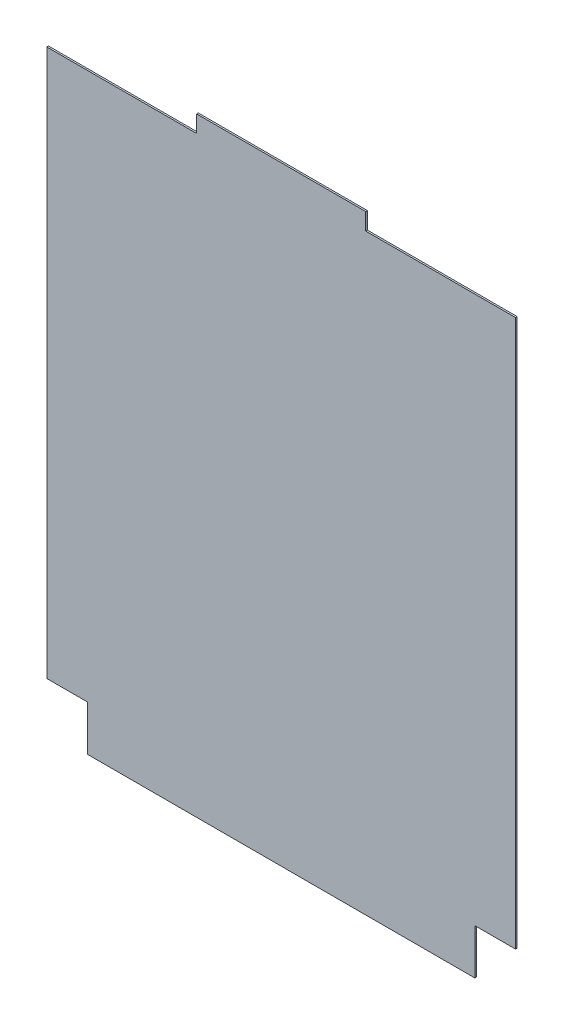
ISO-10303-21;
HEADER;
FILE_DESCRIPTION(('STEP AP214'),'2;1');
FILE_NAME('part.step','',(''),(''),'','','');
FILE_SCHEMA(('AUTOMOTIVE_DESIGN { 1 0 10303 214 1 1 1 1 }'));
ENDSEC;
DATA;
#1=APPLICATION_CONTEXT('core data for automotive mechanical design processes');
#2=APPLICATION_PROTOCOL_DEFINITION('international standard','automotive_design',2000,#1);
#3=PRODUCT_CONTEXT('',#1,'mechanical');
#4=PRODUCT('Part','Part','',(#3));
#5=PRODUCT_RELATED_PRODUCT_CATEGORY('part','',(#4));
#6=PRODUCT_DEFINITION_FORMATION('','',#4);
#7=PRODUCT_DEFINITION_CONTEXT('part definition',#1,'design');
#8=PRODUCT_DEFINITION('design','',#6,#7);
#9=PRODUCT_DEFINITION_SHAPE('','',#8);
#10=(LENGTH_UNIT() NAMED_UNIT(*) SI_UNIT(.MILLI.,.METRE.));
#11=(NAMED_UNIT(*) PLANE_ANGLE_UNIT() SI_UNIT($,.RADIAN.));
#12=(NAMED_UNIT(*) SI_UNIT($,.STERADIAN.) SOLID_ANGLE_UNIT());
#13=UNCERTAINTY_MEASURE_WITH_UNIT(LENGTH_MEASURE(1.E-05),#10,'distance_accuracy_value','');
#14=(GEOMETRIC_REPRESENTATION_CONTEXT(3) GLOBAL_UNCERTAINTY_ASSIGNED_CONTEXT((#13)) GLOBAL_UNIT_ASSIGNED_CONTEXT((#10,
#11,#12)) REPRESENTATION_CONTEXT('',''));
#15=CARTESIAN_POINT('',(0.,0.,0.));
#16=DIRECTION('',(0.,0.,1.));
#17=DIRECTION('',(1.,0.,0.));
#18=AXIS2_PLACEMENT_3D('',#15,#16,#17);
#19=CARTESIAN_POINT('',(7.41806516052539,-16.2979296497676,0.));
#20=DIRECTION('',(0.,0.,1.));
#21=DIRECTION('',(1.,0.,0.));
#22=AXIS2_PLACEMENT_3D('',#19,#20,#21);
#23=PLANE('',#22);
#24=DIRECTION('',(0.,1.,0.));
#25=VECTOR('',#24,1.);
#26=CARTESIAN_POINT('',(-15.4819348394746,-13.6179296497676,0.));
#27=LINE('',#26,#25);
#28=CARTESIAN_POINT('',(-15.4819348394746,-16.2979296497676,0.));
#29=VERTEX_POINT('',#28);
#30=CARTESIAN_POINT('',(-15.4819348394746,-13.6179296497676,0.));
#31=VERTEX_POINT('',#30);
#32=EDGE_CURVE('E169',#29,#31,#27,.T.);
#33=ORIENTED_EDGE('',*,*,#32,.T.);
#34=DIRECTION('',(1.,0.,0.));
#35=VECTOR('',#34,1.);
#36=CARTESIAN_POINT('',(-17.8819348394746,-13.6179296497676,0.));
#37=LINE('',#36,#35);
#38=CARTESIAN_POINT('',(-17.8819348394746,-13.6179296497676,0.));
#39=VERTEX_POINT('',#38);
#40=EDGE_CURVE('E164',#31,#39,#37,.F.);
#41=ORIENTED_EDGE('',*,*,#40,.T.);
#42=DIRECTION('',(0.,1.,0.));
#43=VECTOR('',#42,1.);
#44=CARTESIAN_POINT('',(-17.8819348394746,18.7120703502324,0.));
#45=LINE('',#44,#43);
#46=CARTESIAN_POINT('',(-17.8819348394746,18.7120703502324,0.));
#47=VERTEX_POINT('',#46);
#48=EDGE_CURVE('E159',#39,#47,#45,.T.);
#49=ORIENTED_EDGE('',*,*,#48,.T.);
#50=DIRECTION('',(1.,0.,0.));
#51=VECTOR('',#50,1.);
#52=CARTESIAN_POINT('',(-9.03193483947462,18.7120703502324,0.));
#53=LINE('',#52,#51);
#54=CARTESIAN_POINT('',(-9.03193483947462,18.7120703502324,0.));
#55=VERTEX_POINT('',#54);
#56=EDGE_CURVE('E154',#47,#55,#53,.T.);
#57=ORIENTED_EDGE('',*,*,#56,.T.);
#58=DIRECTION('',(0.,1.,0.));
#59=VECTOR('',#58,1.);
#60=CARTESIAN_POINT('',(-9.03193483947462,19.7120703502324,0.));
#61=LINE('',#60,#59);
#62=CARTESIAN_POINT('',(-9.03193483947462,19.7120703502324,0.));
#63=VERTEX_POINT('',#62);
#64=EDGE_CURVE('E149',#55,#63,#61,.T.);
#65=ORIENTED_EDGE('',*,*,#64,.T.);
#66=DIRECTION('',(1.,0.,0.));
#67=VECTOR('',#66,1.);
#68=CARTESIAN_POINT('',(0.968065160525386,19.7120703502324,0.));
#69=LINE('',#68,#67);
#70=CARTESIAN_POINT('',(0.968065160525386,19.7120703502324,0.));
#71=VERTEX_POINT('',#70);
#72=EDGE_CURVE('E144',#63,#71,#69,.T.);
#73=ORIENTED_EDGE('',*,*,#72,.T.);
#74=DIRECTION('',(0.,1.,0.));
#75=VECTOR('',#74,1.);
#76=CARTESIAN_POINT('',(0.968065160525386,18.7120703502324,0.));
#77=LINE('',#76,#75);
#78=CARTESIAN_POINT('',(0.968065160525386,18.7120703502324,0.));
#79=VERTEX_POINT('',#78);
#80=EDGE_CURVE('E139',#71,#79,#77,.F.);
#81=ORIENTED_EDGE('',*,*,#80,.T.);
#82=DIRECTION('',(1.,0.,0.));
#83=VECTOR('',#82,1.);
#84=CARTESIAN_POINT('',(9.81806516052539,18.7120703502324,0.));
#85=LINE('',#84,#83);
#86=CARTESIAN_POINT('',(9.81806516052539,18.7120703502324,0.));
#87=VERTEX_POINT('',#86);
#88=EDGE_CURVE('E134',#79,#87,#85,.T.);
#89=ORIENTED_EDGE('',*,*,#88,.T.);
#90=DIRECTION('',(0.,-1.,0.));
#91=VECTOR('',#90,1.);
#92=CARTESIAN_POINT('',(9.81806516052539,-13.6179296497676,0.));
#93=LINE('',#92,#91);
#94=CARTESIAN_POINT('',(9.81806516052539,-13.6179296497676,0.));
#95=VERTEX_POINT('',#94);
#96=EDGE_CURVE('E130',#87,#95,#93,.T.);
#97=ORIENTED_EDGE('',*,*,#96,.T.);
#98=DIRECTION('',(1.,0.,0.));
#99=VECTOR('',#98,1.);
#100=CARTESIAN_POINT('',(7.41806516052539,-13.6179296497676,0.));
#101=LINE('',#100,#99);
#102=CARTESIAN_POINT('',(7.41806516052539,-13.6179296497676,0.));
#103=VERTEX_POINT('',#102);
#104=EDGE_CURVE('E117',#95,#103,#101,.F.);
#105=ORIENTED_EDGE('',*,*,#104,.T.);
#106=DIRECTION('',(0.,-1.,0.));
#107=VECTOR('',#106,1.);
#108=CARTESIAN_POINT('',(7.41806516052539,-16.2979296497676,0.));
#109=LINE('',#108,#107);
#110=CARTESIAN_POINT('',(7.41806516052539,-16.2979296497676,0.));
#111=VERTEX_POINT('',#110);
#112=EDGE_CURVE('E103',#103,#111,#109,.T.);
#113=ORIENTED_EDGE('',*,*,#112,.T.);
#114=DIRECTION('',(1.,0.,0.));
#115=VECTOR('',#114,1.);
#116=CARTESIAN_POINT('',(-15.4819348394746,-16.2979296497676,0.));
#117=LINE('',#116,#115);
#118=EDGE_CURVE('E20',#111,#29,#117,.F.);
#119=ORIENTED_EDGE('',*,*,#118,.T.);
#120=EDGE_LOOP('',(#33,#41,#49,#57,#65,#73,#81,#89,#97,#105,#113,#119));
#121=FACE_BOUND('',#120,.T.);
#122=ADVANCED_FACE('F17',(#121),#23,.F.);
#123=CARTESIAN_POINT('',(-15.4819348394746,-16.2979296497676,0.1));
#124=DIRECTION('',(0.,1.,0.));
#125=DIRECTION('',(0.,0.,1.));
#126=AXIS2_PLACEMENT_3D('',#123,#124,#125);
#127=PLANE('',#126);
#128=DIRECTION('',(0.,0.,1.));
#129=VECTOR('',#128,1.);
#130=CARTESIAN_POINT('',(7.41806516052539,-16.2979296497676,0.1));
#131=LINE('',#130,#129);
#132=CARTESIAN_POINT('',(7.41806516052539,-16.2979296497676,0.1));
#133=VERTEX_POINT('',#132);
#134=EDGE_CURVE('E109',#111,#133,#131,.T.);
#135=ORIENTED_EDGE('',*,*,#134,.T.);
#136=DIRECTION('',(1.,0.,0.));
#137=VECTOR('',#136,1.);
#138=CARTESIAN_POINT('',(7.41806516052539,-16.2979296497676,0.1));
#139=LINE('',#138,#137);
#140=CARTESIAN_POINT('',(-15.4819348394746,-16.2979296497676,0.1));
#141=VERTEX_POINT('',#140);
#142=EDGE_CURVE('E171',#141,#133,#139,.T.);
#143=ORIENTED_EDGE('',*,*,#142,.F.);
#144=DIRECTION('',(0.,0.,1.));
#145=VECTOR('',#144,1.);
#146=CARTESIAN_POINT('',(-15.4819348394746,-16.2979296497676,0.1));
#147=LINE('',#146,#145);
#148=EDGE_CURVE('E112',#141,#29,#147,.F.);
#149=ORIENTED_EDGE('',*,*,#148,.T.);
#150=ORIENTED_EDGE('',*,*,#118,.F.);
#151=EDGE_LOOP('',(#135,#143,#149,#150));
#152=FACE_BOUND('',#151,.T.);
#153=ADVANCED_FACE('F108',(#152),#127,.F.);
#154=CARTESIAN_POINT('',(7.41806516052539,-16.2979296497676,0.1));
#155=DIRECTION('',(-1.,0.,0.));
#156=DIRECTION('',(0.,-1.,0.));
#157=AXIS2_PLACEMENT_3D('',#154,#155,#156);
#158=PLANE('',#157);
#159=DIRECTION('',(0.,0.,1.));
#160=VECTOR('',#159,1.);
#161=CARTESIAN_POINT('',(7.41806516052539,-13.6179296497676,0.1));
#162=LINE('',#161,#160);
#163=CARTESIAN_POINT('',(7.41806516052539,-13.6179296497676,0.1));
#164=VERTEX_POINT('',#163);
#165=EDGE_CURVE('E119',#103,#164,#162,.T.);
#166=ORIENTED_EDGE('',*,*,#165,.T.);
#167=DIRECTION('',(0.,1.,0.));
#168=VECTOR('',#167,1.);
#169=CARTESIAN_POINT('',(7.41806516052539,-16.2979296497676,0.1));
#170=LINE('',#169,#168);
#171=EDGE_CURVE('E123',#133,#164,#170,.T.);
#172=ORIENTED_EDGE('',*,*,#171,.F.);
#173=ORIENTED_EDGE('',*,*,#134,.F.);
#174=ORIENTED_EDGE('',*,*,#112,.F.);
#175=EDGE_LOOP('',(#166,#172,#173,#174));
#176=FACE_BOUND('',#175,.T.);
#177=ADVANCED_FACE('F121',(#176),#158,.F.);
#178=CARTESIAN_POINT('',(7.41806516052539,-13.6179296497676,0.1));
#179=DIRECTION('',(0.,1.,0.));
#180=DIRECTION('',(0.,0.,1.));
#181=AXIS2_PLACEMENT_3D('',#178,#179,#180);
#182=PLANE('',#181);
#183=DIRECTION('',(0.,0.,1.));
#184=VECTOR('',#183,1.);
#185=CARTESIAN_POINT('',(9.81806516052539,-13.6179296497676,0.1));
#186=LINE('',#185,#184);
#187=CARTESIAN_POINT('',(9.81806516052539,-13.6179296497676,0.1));
#188=VERTEX_POINT('',#187);
#189=EDGE_CURVE('E128',#95,#188,#186,.T.);
#190=ORIENTED_EDGE('',*,*,#189,.T.);
#191=DIRECTION('',(1.,0.,0.));
#192=VECTOR('',#191,1.);
#193=CARTESIAN_POINT('',(7.41806516052539,-13.6179296497676,0.1));
#194=LINE('',#193,#192);
#195=EDGE_CURVE('E174',#164,#188,#194,.T.);
#196=ORIENTED_EDGE('',*,*,#195,.F.);
#197=ORIENTED_EDGE('',*,*,#165,.F.);
#198=ORIENTED_EDGE('',*,*,#104,.F.);
#199=EDGE_LOOP('',(#190,#196,#197,#198));
#200=FACE_BOUND('',#199,.T.);
#201=ADVANCED_FACE('F244',(#200),#182,.F.);
#202=CARTESIAN_POINT('',(9.81806516052539,-13.6179296497676,0.1));
#203=DIRECTION('',(-1.,0.,0.));
#204=DIRECTION('',(0.,-1.,0.));
#205=AXIS2_PLACEMENT_3D('',#202,#203,#204);
#206=PLANE('',#205);
#207=DIRECTION('',(0.,0.,-1.));
#208=VECTOR('',#207,1.);
#209=CARTESIAN_POINT('',(9.81806516052539,18.7120703502324,0.1));
#210=LINE('',#209,#208);
#211=CARTESIAN_POINT('',(9.81806516052539,18.7120703502324,0.1));
#212=VERTEX_POINT('',#211);
#213=EDGE_CURVE('E132',#87,#212,#210,.F.);
#214=ORIENTED_EDGE('',*,*,#213,.T.);
#215=DIRECTION('',(0.,1.,0.));
#216=VECTOR('',#215,1.);
#217=CARTESIAN_POINT('',(9.81806516052539,-16.2979296497676,0.1));
#218=LINE('',#217,#216);
#219=EDGE_CURVE('E177',#188,#212,#218,.T.);
#220=ORIENTED_EDGE('',*,*,#219,.F.);
#221=ORIENTED_EDGE('',*,*,#189,.F.);
#222=ORIENTED_EDGE('',*,*,#96,.F.);
#223=EDGE_LOOP('',(#214,#220,#221,#222));
#224=FACE_BOUND('',#223,.T.);
#225=ADVANCED_FACE('F240',(#224),#206,.F.);
#226=CARTESIAN_POINT('',(9.81806516052539,18.7120703502324,0.1));
#227=DIRECTION('',(0.,-1.,0.));
#228=DIRECTION('',(0.,0.,-1.));
#229=AXIS2_PLACEMENT_3D('',#226,#227,#228);
#230=PLANE('',#229);
#231=DIRECTION('',(0.,0.,1.));
#232=VECTOR('',#231,1.);
#233=CARTESIAN_POINT('',(0.968065160525386,18.7120703502324,0.1));
#234=LINE('',#233,#232);
#235=CARTESIAN_POINT('',(0.968065160525386,18.7120703502324,0.1));
#236=VERTEX_POINT('',#235);
#237=EDGE_CURVE('E137',#79,#236,#234,.T.);
#238=ORIENTED_EDGE('',*,*,#237,.T.);
#239=DIRECTION('',(1.,0.,0.));
#240=VECTOR('',#239,1.);
#241=CARTESIAN_POINT('',(7.41806516052539,18.7120703502324,0.1));
#242=LINE('',#241,#240);
#243=EDGE_CURVE('E180',#212,#236,#242,.F.);
#244=ORIENTED_EDGE('',*,*,#243,.F.);
#245=ORIENTED_EDGE('',*,*,#213,.F.);
#246=ORIENTED_EDGE('',*,*,#88,.F.);
#247=EDGE_LOOP('',(#238,#244,#245,#246));
#248=FACE_BOUND('',#247,.T.);
#249=ADVANCED_FACE('F236',(#248),#230,.F.);
#250=CARTESIAN_POINT('',(0.968065160525386,18.7120703502324,0.1));
#251=DIRECTION('',(-1.,0.,0.));
#252=DIRECTION('',(0.,0.,1.));
#253=AXIS2_PLACEMENT_3D('',#250,#251,#252);
#254=PLANE('',#253);
#255=DIRECTION('',(0.,0.,1.));
#256=VECTOR('',#255,1.);
#257=CARTESIAN_POINT('',(0.968065160525386,19.7120703502324,0.1));
#258=LINE('',#257,#256);
#259=CARTESIAN_POINT('',(0.968065160525386,19.7120703502324,0.1));
#260=VERTEX_POINT('',#259);
#261=EDGE_CURVE('E142',#71,#260,#258,.T.);
#262=ORIENTED_EDGE('',*,*,#261,.T.);
#263=DIRECTION('',(0.,1.,0.));
#264=VECTOR('',#263,1.);
#265=CARTESIAN_POINT('',(0.968065160525386,-16.2979296497676,0.1));
#266=LINE('',#265,#264);
#267=EDGE_CURVE('E183',#236,#260,#266,.T.);
#268=ORIENTED_EDGE('',*,*,#267,.F.);
#269=ORIENTED_EDGE('',*,*,#237,.F.);
#270=ORIENTED_EDGE('',*,*,#80,.F.);
#271=EDGE_LOOP('',(#262,#268,#269,#270));
#272=FACE_BOUND('',#271,.T.);
#273=ADVANCED_FACE('F232',(#272),#254,.F.);
#274=CARTESIAN_POINT('',(0.968065160525386,19.7120703502324,0.1));
#275=DIRECTION('',(0.,-1.,0.));
#276=DIRECTION('',(1.,0.,0.));
#277=AXIS2_PLACEMENT_3D('',#274,#275,#276);
#278=PLANE('',#277);
#279=DIRECTION('',(0.,0.,-1.));
#280=VECTOR('',#279,1.);
#281=CARTESIAN_POINT('',(-9.03193483947462,19.7120703502324,0.1));
#282=LINE('',#281,#280);
#283=CARTESIAN_POINT('',(-9.03193483947462,19.7120703502324,0.1));
#284=VERTEX_POINT('',#283);
#285=EDGE_CURVE('E147',#63,#284,#282,.F.);
#286=ORIENTED_EDGE('',*,*,#285,.T.);
#287=DIRECTION('',(1.,0.,0.));
#288=VECTOR('',#287,1.);
#289=CARTESIAN_POINT('',(7.41806516052539,19.7120703502324,0.1));
#290=LINE('',#289,#288);
#291=EDGE_CURVE('E186',#260,#284,#290,.F.);
#292=ORIENTED_EDGE('',*,*,#291,.F.);
#293=ORIENTED_EDGE('',*,*,#261,.F.);
#294=ORIENTED_EDGE('',*,*,#72,.F.);
#295=EDGE_LOOP('',(#286,#292,#293,#294));
#296=FACE_BOUND('',#295,.T.);
#297=ADVANCED_FACE('F228',(#296),#278,.F.);
#298=CARTESIAN_POINT('',(-9.03193483947462,19.7120703502324,0.1));
#299=DIRECTION('',(1.,0.,0.));
#300=DIRECTION('',(0.,0.,-1.));
#301=AXIS2_PLACEMENT_3D('',#298,#299,#300);
#302=PLANE('',#301);
#303=DIRECTION('',(0.,0.,-1.));
#304=VECTOR('',#303,1.);
#305=CARTESIAN_POINT('',(-9.03193483947462,18.7120703502324,0.1));
#306=LINE('',#305,#304);
#307=CARTESIAN_POINT('',(-9.03193483947462,18.7120703502324,0.1));
#308=VERTEX_POINT('',#307);
#309=EDGE_CURVE('E152',#55,#308,#306,.F.);
#310=ORIENTED_EDGE('',*,*,#309,.T.);
#311=DIRECTION('',(0.,1.,0.));
#312=VECTOR('',#311,1.);
#313=CARTESIAN_POINT('',(-9.03193483947462,-16.2979296497676,0.1));
#314=LINE('',#313,#312);
#315=EDGE_CURVE('E189',#284,#308,#314,.F.);
#316=ORIENTED_EDGE('',*,*,#315,.F.);
#317=ORIENTED_EDGE('',*,*,#285,.F.);
#318=ORIENTED_EDGE('',*,*,#64,.F.);
#319=EDGE_LOOP('',(#310,#316,#317,#318));
#320=FACE_BOUND('',#319,.T.);
#321=ADVANCED_FACE('F224',(#320),#302,.F.);
#322=CARTESIAN_POINT('',(-9.03193483947462,18.7120703502324,0.1));
#323=DIRECTION('',(0.,-1.,0.));
#324=DIRECTION('',(0.,0.,-1.));
#325=AXIS2_PLACEMENT_3D('',#322,#323,#324);
#326=PLANE('',#325);
#327=DIRECTION('',(0.,0.,1.));
#328=VECTOR('',#327,1.);
#329=CARTESIAN_POINT('',(-17.8819348394746,18.7120703502324,0.1));
#330=LINE('',#329,#328);
#331=CARTESIAN_POINT('',(-17.8819348394746,18.7120703502324,0.1));
#332=VERTEX_POINT('',#331);
#333=EDGE_CURVE('E157',#47,#332,#330,.T.);
#334=ORIENTED_EDGE('',*,*,#333,.T.);
#335=DIRECTION('',(1.,0.,0.));
#336=VECTOR('',#335,1.);
#337=CARTESIAN_POINT('',(7.41806516052539,18.7120703502324,0.1));
#338=LINE('',#337,#336);
#339=EDGE_CURVE('E192',#308,#332,#338,.F.);
#340=ORIENTED_EDGE('',*,*,#339,.F.);
#341=ORIENTED_EDGE('',*,*,#309,.F.);
#342=ORIENTED_EDGE('',*,*,#56,.F.);
#343=EDGE_LOOP('',(#334,#340,#341,#342));
#344=FACE_BOUND('',#343,.T.);
#345=ADVANCED_FACE('F221',(#344),#326,.F.);
#346=CARTESIAN_POINT('',(-17.8819348394746,18.7120703502324,0.1));
#347=DIRECTION('',(1.,0.,0.));
#348=DIRECTION('',(0.,1.,0.));
#349=AXIS2_PLACEMENT_3D('',#346,#347,#348);
#350=PLANE('',#349);
#351=DIRECTION('',(0.,0.,1.));
#352=VECTOR('',#351,1.);
#353=CARTESIAN_POINT('',(-17.8819348394746,-13.6179296497676,0.1));
#354=LINE('',#353,#352);
#355=CARTESIAN_POINT('',(-17.8819348394746,-13.6179296497676,0.1));
#356=VERTEX_POINT('',#355);
#357=EDGE_CURVE('E162',#39,#356,#354,.T.);
#358=ORIENTED_EDGE('',*,*,#357,.T.);
#359=DIRECTION('',(0.,1.,0.));
#360=VECTOR('',#359,1.);
#361=CARTESIAN_POINT('',(-17.8819348394746,-16.2979296497676,0.1));
#362=LINE('',#361,#360);
#363=EDGE_CURVE('E195',#332,#356,#362,.F.);
#364=ORIENTED_EDGE('',*,*,#363,.F.);
#365=ORIENTED_EDGE('',*,*,#333,.F.);
#366=ORIENTED_EDGE('',*,*,#48,.F.);
#367=EDGE_LOOP('',(#358,#364,#365,#366));
#368=FACE_BOUND('',#367,.T.);
#369=ADVANCED_FACE('F205',(#368),#350,.F.);
#370=CARTESIAN_POINT('',(-17.8819348394746,-13.6179296497676,0.1));
#371=DIRECTION('',(0.,1.,0.));
#372=DIRECTION('',(0.,0.,1.));
#373=AXIS2_PLACEMENT_3D('',#370,#371,#372);
#374=PLANE('',#373);
#375=DIRECTION('',(0.,0.,1.));
#376=VECTOR('',#375,1.);
#377=CARTESIAN_POINT('',(-15.4819348394746,-13.6179296497676,0.1));
#378=LINE('',#377,#376);
#379=CARTESIAN_POINT('',(-15.4819348394746,-13.6179296497676,0.1));
#380=VERTEX_POINT('',#379);
#381=EDGE_CURVE('E35',#31,#380,#378,.T.);
#382=ORIENTED_EDGE('',*,*,#381,.T.);
#383=DIRECTION('',(1.,0.,0.));
#384=VECTOR('',#383,1.);
#385=CARTESIAN_POINT('',(7.41806516052539,-13.6179296497676,0.1));
#386=LINE('',#385,#384);
#387=EDGE_CURVE('E26',#356,#380,#386,.T.);
#388=ORIENTED_EDGE('',*,*,#387,.F.);
#389=ORIENTED_EDGE('',*,*,#357,.F.);
#390=ORIENTED_EDGE('',*,*,#40,.F.);
#391=EDGE_LOOP('',(#382,#388,#389,#390));
#392=FACE_BOUND('',#391,.T.);
#393=ADVANCED_FACE('F203',(#392),#374,.F.);
#394=CARTESIAN_POINT('',(-15.4819348394746,-13.6179296497676,0.1));
#395=DIRECTION('',(1.,0.,0.));
#396=DIRECTION('',(0.,1.,0.));
#397=AXIS2_PLACEMENT_3D('',#394,#395,#396);
#398=PLANE('',#397);
#399=ORIENTED_EDGE('',*,*,#148,.F.);
#400=DIRECTION('',(0.,1.,0.));
#401=VECTOR('',#400,1.);
#402=CARTESIAN_POINT('',(-15.4819348394746,-16.2979296497676,0.1));
#403=LINE('',#402,#401);
#404=EDGE_CURVE('E11',#380,#141,#403,.F.);
#405=ORIENTED_EDGE('',*,*,#404,.F.);
#406=ORIENTED_EDGE('',*,*,#381,.F.);
#407=ORIENTED_EDGE('',*,*,#32,.F.);
#408=EDGE_LOOP('',(#399,#405,#406,#407));
#409=FACE_BOUND('',#408,.T.);
#410=ADVANCED_FACE('F208',(#409),#398,.F.);
#411=CARTESIAN_POINT('',(7.41806516052539,-16.2979296497676,0.1));
#412=DIRECTION('',(0.,0.,1.));
#413=DIRECTION('',(1.,0.,0.));
#414=AXIS2_PLACEMENT_3D('',#411,#412,#413);
#415=PLANE('',#414);
#416=ORIENTED_EDGE('',*,*,#387,.T.);
#417=ORIENTED_EDGE('',*,*,#404,.T.);
#418=ORIENTED_EDGE('',*,*,#142,.T.);
#419=ORIENTED_EDGE('',*,*,#171,.T.);
#420=ORIENTED_EDGE('',*,*,#195,.T.);
#421=ORIENTED_EDGE('',*,*,#219,.T.);
#422=ORIENTED_EDGE('',*,*,#243,.T.);
#423=ORIENTED_EDGE('',*,*,#267,.T.);
#424=ORIENTED_EDGE('',*,*,#291,.T.);
#425=ORIENTED_EDGE('',*,*,#315,.T.);
#426=ORIENTED_EDGE('',*,*,#339,.T.);
#427=ORIENTED_EDGE('',*,*,#363,.T.);
#428=EDGE_LOOP('',(#416,#417,#418,#419,#420,#421,#422,#423,#424,#425,#426,#427));
#429=FACE_BOUND('',#428,.T.);
#430=ADVANCED_FACE('F200',(#429),#415,.T.);
#431=CLOSED_SHELL('',(#122,#153,#177,#201,#225,#249,#273,#297,#321,#345,#369,#393,#410,#430));
#432=MANIFOLD_SOLID_BREP('B1',#431);
#433=ADVANCED_BREP_SHAPE_REPRESENTATION('',(#18,#432),#14);
#434=SHAPE_DEFINITION_REPRESENTATION(#9,#433);
ENDSEC;
END-ISO-10303-21;
